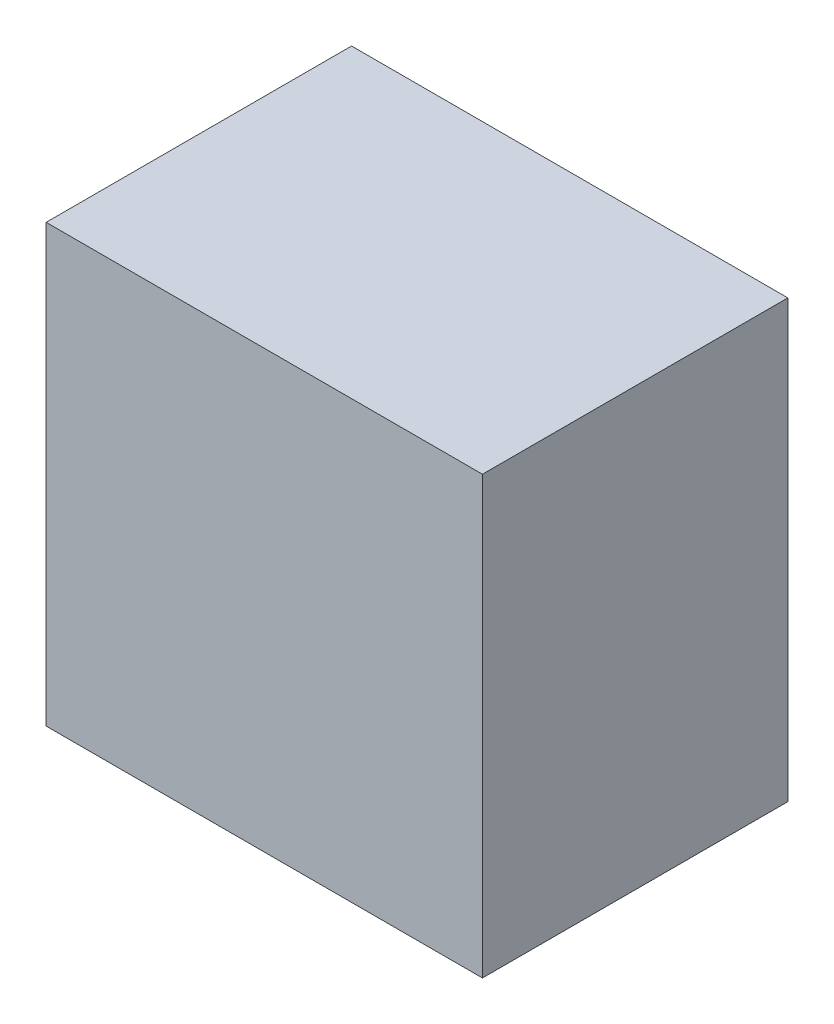
ISO-10303-21;
HEADER;
FILE_DESCRIPTION(('STEP AP214'),'2;1');
FILE_NAME('part.step','',(''),(''),'','','');
FILE_SCHEMA(('AUTOMOTIVE_DESIGN { 1 0 10303 214 1 1 1 1 }'));
ENDSEC;
DATA;
#1=APPLICATION_CONTEXT('core data for automotive mechanical design processes');
#2=APPLICATION_PROTOCOL_DEFINITION('international standard','automotive_design',2000,#1);
#3=PRODUCT_CONTEXT('',#1,'mechanical');
#4=PRODUCT('Part','Part','',(#3));
#5=PRODUCT_RELATED_PRODUCT_CATEGORY('part','',(#4));
#6=PRODUCT_DEFINITION_FORMATION('','',#4);
#7=PRODUCT_DEFINITION_CONTEXT('part definition',#1,'design');
#8=PRODUCT_DEFINITION('design','',#6,#7);
#9=PRODUCT_DEFINITION_SHAPE('','',#8);
#10=(LENGTH_UNIT() NAMED_UNIT(*) SI_UNIT(.MILLI.,.METRE.));
#11=(NAMED_UNIT(*) PLANE_ANGLE_UNIT() SI_UNIT($,.RADIAN.));
#12=(NAMED_UNIT(*) SI_UNIT($,.STERADIAN.) SOLID_ANGLE_UNIT());
#13=UNCERTAINTY_MEASURE_WITH_UNIT(LENGTH_MEASURE(1.E-05),#10,'distance_accuracy_value','');
#14=(GEOMETRIC_REPRESENTATION_CONTEXT(3) GLOBAL_UNCERTAINTY_ASSIGNED_CONTEXT((#13)) GLOBAL_UNIT_ASSIGNED_CONTEXT((#10,
#11,#12)) REPRESENTATION_CONTEXT('',''));
#15=CARTESIAN_POINT('',(0.,0.,0.));
#16=DIRECTION('',(0.,0.,1.));
#17=DIRECTION('',(1.,0.,0.));
#18=AXIS2_PLACEMENT_3D('',#15,#16,#17);
#19=CARTESIAN_POINT('',(20.,20.,28.));
#20=DIRECTION('',(-1.,0.,0.));
#21=DIRECTION('',(0.,-1.,0.));
#22=AXIS2_PLACEMENT_3D('',#19,#20,#21);
#23=PLANE('',#22);
#24=DIRECTION('',(0.,1.,0.));
#25=VECTOR('',#24,1.);
#26=CARTESIAN_POINT('',(20.,20.,0.));
#27=LINE('',#26,#25);
#28=CARTESIAN_POINT('',(20.,-20.,0.));
#29=VERTEX_POINT('',#28);
#30=CARTESIAN_POINT('',(20.,20.,0.));
#31=VERTEX_POINT('',#30);
#32=EDGE_CURVE('E99',#29,#31,#27,.T.);
#33=ORIENTED_EDGE('',*,*,#32,.T.);
#34=DIRECTION('',(0.,0.,-1.));
#35=VECTOR('',#34,1.);
#36=CARTESIAN_POINT('',(20.,20.,28.));
#37=LINE('',#36,#35);
#38=CARTESIAN_POINT('',(20.,20.,28.));
#39=VERTEX_POINT('',#38);
#40=EDGE_CURVE('E11',#39,#31,#37,.T.);
#41=ORIENTED_EDGE('',*,*,#40,.F.);
#42=DIRECTION('',(0.,1.,0.));
#43=VECTOR('',#42,1.);
#44=CARTESIAN_POINT('',(20.,20.,28.));
#45=LINE('',#44,#43);
#46=CARTESIAN_POINT('',(20.,-20.,28.));
#47=VERTEX_POINT('',#46);
#48=EDGE_CURVE('E87',#47,#39,#45,.T.);
#49=ORIENTED_EDGE('',*,*,#48,.F.);
#50=DIRECTION('',(0.,0.,-1.));
#51=VECTOR('',#50,1.);
#52=CARTESIAN_POINT('',(20.,-20.,28.));
#53=LINE('',#52,#51);
#54=EDGE_CURVE('E95',#47,#29,#53,.T.);
#55=ORIENTED_EDGE('',*,*,#54,.T.);
#56=EDGE_LOOP('',(#33,#41,#49,#55));
#57=FACE_BOUND('',#56,.T.);
#58=ADVANCED_FACE('F36',(#57),#23,.F.);
#59=CARTESIAN_POINT('',(-20.,20.,28.));
#60=DIRECTION('',(0.,-1.,0.));
#61=DIRECTION('',(0.,0.,-1.));
#62=AXIS2_PLACEMENT_3D('',#59,#60,#61);
#63=PLANE('',#62);
#64=DIRECTION('',(-1.,0.,0.));
#65=VECTOR('',#64,1.);
#66=CARTESIAN_POINT('',(-20.,20.,0.));
#67=LINE('',#66,#65);
#68=CARTESIAN_POINT('',(-20.,20.,0.));
#69=VERTEX_POINT('',#68);
#70=EDGE_CURVE('E91',#31,#69,#67,.T.);
#71=ORIENTED_EDGE('',*,*,#70,.T.);
#72=DIRECTION('',(0.,0.,-1.));
#73=VECTOR('',#72,1.);
#74=CARTESIAN_POINT('',(-20.,20.,28.));
#75=LINE('',#74,#73);
#76=CARTESIAN_POINT('',(-20.,20.,28.));
#77=VERTEX_POINT('',#76);
#78=EDGE_CURVE('E44',#77,#69,#75,.T.);
#79=ORIENTED_EDGE('',*,*,#78,.F.);
#80=DIRECTION('',(-1.,0.,0.));
#81=VECTOR('',#80,1.);
#82=CARTESIAN_POINT('',(-20.,20.,28.));
#83=LINE('',#82,#81);
#84=EDGE_CURVE('E82',#39,#77,#83,.T.);
#85=ORIENTED_EDGE('',*,*,#84,.F.);
#86=ORIENTED_EDGE('',*,*,#40,.T.);
#87=EDGE_LOOP('',(#71,#79,#85,#86));
#88=FACE_BOUND('',#87,.T.);
#89=ADVANCED_FACE('F90',(#88),#63,.F.);
#90=CARTESIAN_POINT('',(-20.,20.,28.));
#91=DIRECTION('',(1.,0.,0.));
#92=DIRECTION('',(0.,1.,0.));
#93=AXIS2_PLACEMENT_3D('',#90,#91,#92);
#94=PLANE('',#93);
#95=DIRECTION('',(0.,-1.,0.));
#96=VECTOR('',#95,1.);
#97=CARTESIAN_POINT('',(-20.,20.,0.));
#98=LINE('',#97,#96);
#99=CARTESIAN_POINT('',(-20.,-20.,0.));
#100=VERTEX_POINT('',#99);
#101=EDGE_CURVE('E69',#69,#100,#98,.T.);
#102=ORIENTED_EDGE('',*,*,#101,.T.);
#103=DIRECTION('',(0.,0.,-1.));
#104=VECTOR('',#103,1.);
#105=CARTESIAN_POINT('',(-20.,-20.,28.));
#106=LINE('',#105,#104);
#107=CARTESIAN_POINT('',(-20.,-20.,28.));
#108=VERTEX_POINT('',#107);
#109=EDGE_CURVE('E92',#108,#100,#106,.T.);
#110=ORIENTED_EDGE('',*,*,#109,.F.);
#111=DIRECTION('',(0.,-1.,0.));
#112=VECTOR('',#111,1.);
#113=CARTESIAN_POINT('',(-20.,20.,28.));
#114=LINE('',#113,#112);
#115=EDGE_CURVE('E85',#77,#108,#114,.T.);
#116=ORIENTED_EDGE('',*,*,#115,.F.);
#117=ORIENTED_EDGE('',*,*,#78,.T.);
#118=EDGE_LOOP('',(#102,#110,#116,#117));
#119=FACE_BOUND('',#118,.T.);
#120=ADVANCED_FACE('F93',(#119),#94,.F.);
#121=CARTESIAN_POINT('',(-20.,-20.,28.));
#122=DIRECTION('',(0.,1.,0.));
#123=DIRECTION('',(0.,0.,1.));
#124=AXIS2_PLACEMENT_3D('',#121,#122,#123);
#125=PLANE('',#124);
#126=DIRECTION('',(1.,0.,0.));
#127=VECTOR('',#126,1.);
#128=CARTESIAN_POINT('',(-20.,-20.,0.));
#129=LINE('',#128,#127);
#130=EDGE_CURVE('E75',#100,#29,#129,.T.);
#131=ORIENTED_EDGE('',*,*,#130,.T.);
#132=ORIENTED_EDGE('',*,*,#54,.F.);
#133=DIRECTION('',(1.,0.,0.));
#134=VECTOR('',#133,1.);
#135=CARTESIAN_POINT('',(-20.,-20.,28.));
#136=LINE('',#135,#134);
#137=EDGE_CURVE('E52',#108,#47,#136,.T.);
#138=ORIENTED_EDGE('',*,*,#137,.F.);
#139=ORIENTED_EDGE('',*,*,#109,.T.);
#140=EDGE_LOOP('',(#131,#132,#138,#139));
#141=FACE_BOUND('',#140,.T.);
#142=ADVANCED_FACE('F106',(#141),#125,.F.);
#143=CARTESIAN_POINT('',(0.,0.,28.));
#144=DIRECTION('',(0.,0.,1.));
#145=DIRECTION('',(1.,0.,0.));
#146=AXIS2_PLACEMENT_3D('',#143,#144,#145);
#147=PLANE('',#146);
#148=ORIENTED_EDGE('',*,*,#48,.T.);
#149=ORIENTED_EDGE('',*,*,#84,.T.);
#150=ORIENTED_EDGE('',*,*,#115,.T.);
#151=ORIENTED_EDGE('',*,*,#137,.T.);
#152=EDGE_LOOP('',(#148,#149,#150,#151));
#153=FACE_BOUND('',#152,.T.);
#154=ADVANCED_FACE('F83',(#153),#147,.T.);
#155=CARTESIAN_POINT('',(0.,0.,0.));
#156=DIRECTION('',(0.,0.,1.));
#157=DIRECTION('',(1.,0.,0.));
#158=AXIS2_PLACEMENT_3D('',#155,#156,#157);
#159=PLANE('',#158);
#160=ORIENTED_EDGE('',*,*,#32,.F.);
#161=ORIENTED_EDGE('',*,*,#130,.F.);
#162=ORIENTED_EDGE('',*,*,#101,.F.);
#163=ORIENTED_EDGE('',*,*,#70,.F.);
#164=EDGE_LOOP('',(#160,#161,#162,#163));
#165=FACE_BOUND('',#164,.T.);
#166=ADVANCED_FACE('F109',(#165),#159,.F.);
#167=CLOSED_SHELL('',(#58,#89,#120,#142,#154,#166));
#168=MANIFOLD_SOLID_BREP('B2',#167);
#169=ADVANCED_BREP_SHAPE_REPRESENTATION('',(#18,#168),#14);
#170=SHAPE_DEFINITION_REPRESENTATION(#9,#169);
ENDSEC;
END-ISO-10303-21;
